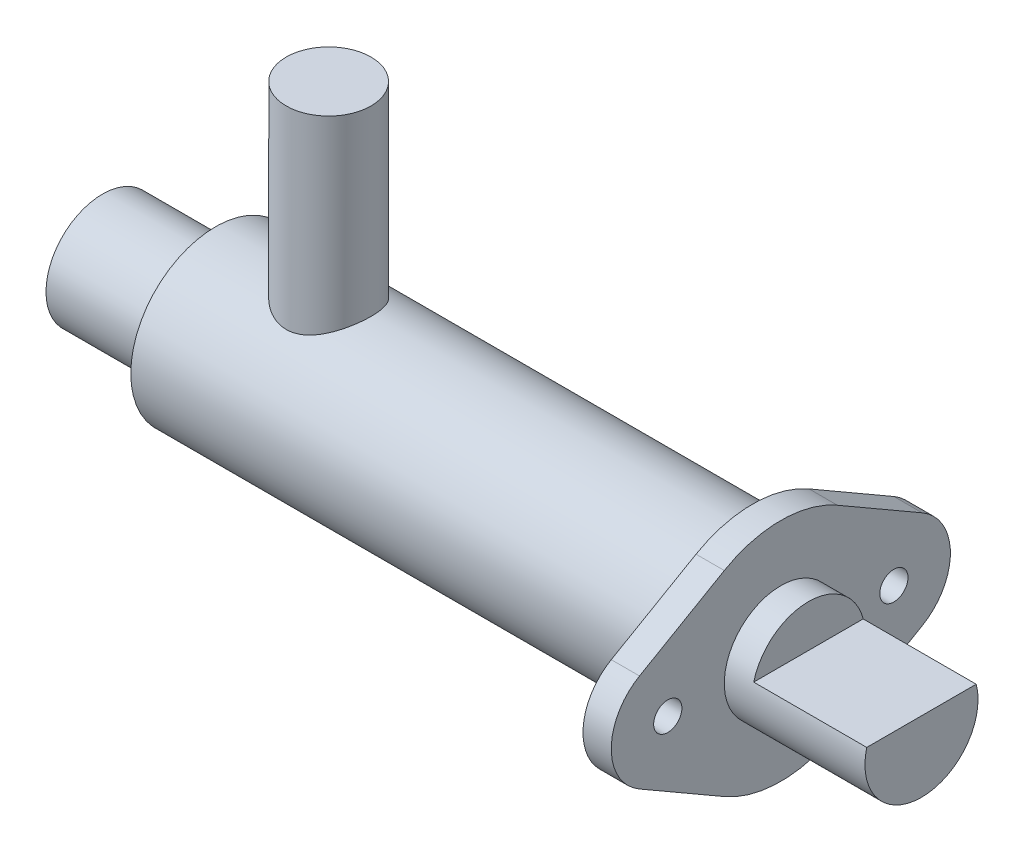
ISO-10303-21;
HEADER;
FILE_DESCRIPTION(('STEP AP214'),'2;1');
FILE_NAME('part.step','',(''),(''),'','','');
FILE_SCHEMA(('AUTOMOTIVE_DESIGN { 1 0 10303 214 1 1 1 1 }'));
ENDSEC;
DATA;
#1=APPLICATION_CONTEXT('core data for automotive mechanical design processes');
#2=APPLICATION_PROTOCOL_DEFINITION('international standard','automotive_design',2000,#1);
#3=PRODUCT_CONTEXT('',#1,'mechanical');
#4=PRODUCT('Part','Part','',(#3));
#5=PRODUCT_RELATED_PRODUCT_CATEGORY('part','',(#4));
#6=PRODUCT_DEFINITION_FORMATION('','',#4);
#7=PRODUCT_DEFINITION_CONTEXT('part definition',#1,'design');
#8=PRODUCT_DEFINITION('design','',#6,#7);
#9=PRODUCT_DEFINITION_SHAPE('','',#8);
#10=(LENGTH_UNIT() NAMED_UNIT(*) SI_UNIT(.MILLI.,.METRE.));
#11=(NAMED_UNIT(*) PLANE_ANGLE_UNIT() SI_UNIT($,.RADIAN.));
#12=(NAMED_UNIT(*) SI_UNIT($,.STERADIAN.) SOLID_ANGLE_UNIT());
#13=UNCERTAINTY_MEASURE_WITH_UNIT(LENGTH_MEASURE(1.E-05),#10,'distance_accuracy_value','');
#14=(GEOMETRIC_REPRESENTATION_CONTEXT(3) GLOBAL_UNCERTAINTY_ASSIGNED_CONTEXT((#13)) GLOBAL_UNIT_ASSIGNED_CONTEXT((#10,
#11,#12)) REPRESENTATION_CONTEXT('',''));
#15=CARTESIAN_POINT('',(0.,0.,0.));
#16=DIRECTION('',(0.,0.,1.));
#17=DIRECTION('',(1.,0.,0.));
#18=AXIS2_PLACEMENT_3D('',#15,#16,#17);
#19=CARTESIAN_POINT('',(-47.625,0.,0.));
#20=DIRECTION('',(-1.,0.,0.));
#21=DIRECTION('',(0.,0.,1.));
#22=AXIS2_PLACEMENT_3D('',#19,#20,#21);
#23=CYLINDRICAL_SURFACE('',#22,9.525);
#24=CARTESIAN_POINT('',(-34.925,0.,0.));
#25=DIRECTION('',(-1.,0.,0.));
#26=DIRECTION('',(0.,0.,1.));
#27=AXIS2_PLACEMENT_3D('',#24,#25,#26);
#28=CIRCLE('',#27,9.525);
#29=CARTESIAN_POINT('',(-34.925,0.,9.525));
#30=VERTEX_POINT('',#29);
#31=EDGE_CURVE('E49',#30,#30,#28,.T.);
#32=ORIENTED_EDGE('',*,*,#31,.F.);
#33=EDGE_LOOP('',(#32));
#34=FACE_BOUND('',#33,.T.);
#35=CARTESIAN_POINT('',(25.4,0.,0.));
#36=DIRECTION('',(-1.,0.,0.));
#37=DIRECTION('',(0.,0.,1.));
#38=AXIS2_PLACEMENT_3D('',#35,#36,#37);
#39=CIRCLE('',#38,9.525);
#40=CARTESIAN_POINT('',(25.4,0.,9.525));
#41=VERTEX_POINT('',#40);
#42=EDGE_CURVE('E11',#41,#41,#39,.F.);
#43=ORIENTED_EDGE('',*,*,#42,.F.);
#44=EDGE_LOOP('',(#43));
#45=FACE_BOUND('',#44,.T.);
#46=CARTESIAN_POINT('',(-22.225,8.24889197104678,-4.7625));
#47=CARTESIAN_POINT('',(-22.1008590969017,8.24889272394164,-4.76249940729929));
#48=CARTESIAN_POINT('',(-21.9767071497996,8.25170408952825,-4.75763943059537));
#49=CARTESIAN_POINT('',(-21.7293616546142,8.26284430339843,-4.73826449608749));
#50=CARTESIAN_POINT('',(-21.6061685797408,8.27117572034719,-4.72374504339219));
#51=CARTESIAN_POINT('',(-21.3615458554706,8.29306424044599,-4.68521103701737));
#52=CARTESIAN_POINT('',(-21.2401192826448,8.30662953786715,-4.66118159277235));
#53=CARTESIAN_POINT('',(-21.0000683650749,8.33849424083486,-4.60393332228032));
#54=CARTESIAN_POINT('',(-20.8814452632816,8.35679570478326,-4.57071050003109));
#55=CARTESIAN_POINT('',(-20.5323015748237,8.41767757563678,-4.45820926505094));
#56=CARTESIAN_POINT('',(-20.3069199645013,8.46639036631087,-4.36584227707579));
#57=CARTESIAN_POINT('',(-19.8750282380635,8.57453511094491,-4.14940045989174));
#58=CARTESIAN_POINT('',(-19.6685191436925,8.63396764474657,-4.02532391532954));
#59=CARTESIAN_POINT('',(-19.2612861365955,8.76284791263908,-3.73698658313422));
#60=CARTESIAN_POINT('',(-19.0624441753375,8.83271738343829,-3.57025552600526));
#61=CARTESIAN_POINT('',(-18.6940167283998,8.97122433178734,-3.20633353614955));
#62=CARTESIAN_POINT('',(-18.5244458361945,9.03986117960625,-3.00912750204738));
#63=CARTESIAN_POINT('',(-18.2900068266763,9.13908932048077,-2.68636629044315));
#64=CARTESIAN_POINT('',(-18.2131527226233,9.17251360649317,-2.57020878007104));
#65=CARTESIAN_POINT('',(-18.069596196185,9.23620349246427,-2.33097830003148));
#66=CARTESIAN_POINT('',(-18.0028897332615,9.26647034811662,-2.20790810968896));
#67=CARTESIAN_POINT('',(-17.8802891396933,9.32297018211123,-1.95564815668434));
#68=CARTESIAN_POINT('',(-17.8243922237504,9.34920419923749,-1.82645998115371));
#69=CARTESIAN_POINT('',(-17.7240269574238,9.39686248352726,-1.56285911383248));
#70=CARTESIAN_POINT('',(-17.6795573931323,9.41828726153724,-1.42844697872178));
#71=CARTESIAN_POINT('',(-17.6053602243203,9.45432792849539,-1.16519740858918));
#72=CARTESIAN_POINT('',(-17.5748091705922,9.46931966688269,-1.03664325296874));
#73=CARTESIAN_POINT('',(-17.5244444767481,9.49415396935545,-0.776963002287312));
#74=CARTESIAN_POINT('',(-17.5046297912202,9.50399703476961,-0.645837158923183));
#75=CARTESIAN_POINT('',(-17.4760065343755,9.51824582475992,-0.382159245593984));
#76=CARTESIAN_POINT('',(-17.4671926503398,9.52265417396123,-0.249607895282792));
#77=CARTESIAN_POINT('',(-17.4606765974385,9.52591136422363,0.0158324946519545));
#78=CARTESIAN_POINT('',(-17.4629737487424,9.52476054542327,0.148721513117989));
#79=CARTESIAN_POINT('',(-17.4779596490716,9.51727773119995,0.402105764472281));
#80=CARTESIAN_POINT('',(-17.489724135882,9.5114066080277,0.522670621045648));
#81=CARTESIAN_POINT('',(-17.52234802378,9.49520689673846,0.762297504084285));
#82=CARTESIAN_POINT('',(-17.5432102971939,9.48487690088979,0.881359043701557));
#83=CARTESIAN_POINT('',(-17.5937985131175,9.4600084221586,1.1170953858544));
#84=CARTESIAN_POINT('',(-17.6235214848597,9.44547134984976,1.23377097435057));
#85=CARTESIAN_POINT('',(-17.6915263412339,9.41253030003386,1.46405663273085));
#86=CARTESIAN_POINT('',(-17.7298115145343,9.39412483687505,1.57766550587512));
#87=CARTESIAN_POINT('',(-17.8581442489874,9.33315909327112,1.91586173980296));
#88=CARTESIAN_POINT('',(-17.961008933467,9.28518547508369,2.13476891421778));
#89=CARTESIAN_POINT('',(-18.1971915319788,9.1791264414455,2.55262754610699));
#90=CARTESIAN_POINT('',(-18.330520348699,9.12103740760329,2.75157182236461));
#91=CARTESIAN_POINT('',(-18.6383264592419,8.99371794927081,3.14406030579801));
#92=CARTESIAN_POINT('',(-18.815502061308,8.92395340854905,3.33531640619751));
#93=CARTESIAN_POINT('',(-19.1988972053729,8.78462733363278,3.68669670801986));
#94=CARTESIAN_POINT('',(-19.4051388849274,8.71506599580986,3.84679695689711));
#95=CARTESIAN_POINT('',(-19.7401135248814,8.61432292972857,4.06522723980458));
#96=CARTESIAN_POINT('',(-19.859994477451,8.58040455630013,4.13613898270465));
#97=CARTESIAN_POINT('',(-20.1061806073308,8.51583950077812,4.2674875647323));
#98=CARTESIAN_POINT('',(-20.2324828617701,8.48519134947439,4.32792911546943));
#99=CARTESIAN_POINT('',(-20.4907225092646,8.42829064611799,4.43772127646409));
#100=CARTESIAN_POINT('',(-20.6226579040663,8.40203655134898,4.48707578138171));
#101=CARTESIAN_POINT('',(-20.8912053825654,8.35498507502528,4.57409004971375));
#102=CARTESIAN_POINT('',(-21.0278145200478,8.33418432493701,4.61175703516624));
#103=CARTESIAN_POINT('',(-21.2937251064497,8.30033105740274,4.67239107161606));
#104=CARTESIAN_POINT('',(-21.4227546942039,8.28679731609861,4.69628224178035));
#105=CARTESIAN_POINT('',(-21.6827672095106,8.26567972970449,4.73335209140224));
#106=CARTESIAN_POINT('',(-21.8137490850902,8.25809279049908,4.74653634178892));
#107=CARTESIAN_POINT('',(-22.0765199908754,8.24918359612277,4.76200330923097));
#108=CARTESIAN_POINT('',(-22.208308702214,8.24785900822165,4.76429008560556));
#109=CARTESIAN_POINT('',(-22.4715269161829,8.25152581127932,4.75793657566527));
#110=CARTESIAN_POINT('',(-22.6029564424594,8.25651677591305,4.74929702692111));
#111=CARTESIAN_POINT('',(-22.8499235335336,8.27171481492305,4.72277057816311));
#112=CARTESIAN_POINT('',(-22.9656220514088,8.28128924981291,4.7060027358946));
#113=CARTESIAN_POINT('',(-23.19504203488,8.30494741203159,4.66412284465984));
#114=CARTESIAN_POINT('',(-23.3087628674355,8.3190325561764,4.63900817385685));
#115=CARTESIAN_POINT('',(-23.64585381483,8.36742301080679,4.55152408813005));
#116=CARTESIAN_POINT('',(-23.8653138630672,8.40787423037301,4.47699683650417));
#117=CARTESIAN_POINT('',(-24.2986813068859,8.50278882622772,4.29409140569222));
#118=CARTESIAN_POINT('',(-24.5118607665569,8.55781440671015,4.18430528181162));
#119=CARTESIAN_POINT('',(-24.9180392026927,8.67518529385013,3.93519108835804));
#120=CARTESIAN_POINT('',(-25.1110277360791,8.73753435328997,3.79584784304953));
#121=CARTESIAN_POINT('',(-25.4967340619561,8.87196405469708,3.4710976585416));
#122=CARTESIAN_POINT('',(-25.6863511708933,8.94428069402612,3.28209830684247));
#123=CARTESIAN_POINT('',(-26.0322210496743,9.08372577215842,2.87366994707528));
#124=CARTESIAN_POINT('',(-26.1884625493693,9.15085245356966,2.65423070130585));
#125=CARTESIAN_POINT('',(-26.3960065237566,9.24324496229829,2.30289806207734));
#126=CARTESIAN_POINT('',(-26.4613981500596,9.27299632526352,2.18030840919905));
#127=CARTESIAN_POINT('',(-26.581503084002,9.32847745043035,1.92915304044621));
#128=CARTESIAN_POINT('',(-26.6362211212174,9.35420899284426,1.80059000285164));
#129=CARTESIAN_POINT('',(-26.7343425578048,9.40087915370989,1.53844708260747));
#130=CARTESIAN_POINT('',(-26.7777513541146,9.42182005774161,1.40486962786039));
#131=CARTESIAN_POINT('',(-26.8527298949067,9.45827821966215,1.13371049467199));
#132=CARTESIAN_POINT('',(-26.8843010432804,9.47379612067972,0.996129293143722));
#133=CARTESIAN_POINT('',(-26.9328217695269,9.49775785076806,0.730949873202789));
#134=CARTESIAN_POINT('',(-26.9508474215171,9.50672024509145,0.603594424498007));
#135=CARTESIAN_POINT('',(-26.9765400141555,9.51951815365963,0.347590307680262));
#136=CARTESIAN_POINT('',(-26.9842077551466,9.52335406402124,0.218941740258937));
#137=CARTESIAN_POINT('',(-26.9890841762651,9.52579195912168,-0.0385649394422882));
#138=CARTESIAN_POINT('',(-26.9862959003281,9.52439546710759,-0.167422979823386));
#139=CARTESIAN_POINT('',(-26.9703049482656,9.51641162435963,-0.42432469061339));
#140=CARTESIAN_POINT('',(-26.9571025588401,9.50982441652587,-0.552368383343416));
#141=CARTESIAN_POINT('',(-26.921665410355,9.4922422956568,-0.798199011861468));
#142=CARTESIAN_POINT('',(-26.9000863753989,9.48156800281864,-0.916103849257604));
#143=CARTESIAN_POINT('',(-26.8482319693504,9.45610870385304,-1.14954398448084));
#144=CARTESIAN_POINT('',(-26.8179538290378,9.44132238877767,-1.26507851519123));
#145=CARTESIAN_POINT('',(-26.7145056473315,9.39128133846021,-1.60695881055025));
#146=CARTESIAN_POINT('',(-26.6286914163555,9.35032881269076,-1.8287887060402));
#147=CARTESIAN_POINT('',(-26.4220557838121,9.25477034679553,-2.26424000888416));
#148=CARTESIAN_POINT('',(-26.2998940929096,9.1996553597058,-2.47710454166772));
#149=CARTESIAN_POINT('',(-26.0256747343117,9.08152237528229,-2.88023067814637));
#150=CARTESIAN_POINT('',(-25.873603335527,9.01850075296339,-3.07048183578565));
#151=CARTESIAN_POINT('',(-25.5263886495207,8.88342722741462,-3.44287591291447));
#152=CARTESIAN_POINT('',(-25.3284649955475,8.81110081200555,-3.62232759996091));
#153=CARTESIAN_POINT('',(-24.9040995620519,8.67074486013806,-3.94652779549558));
#154=CARTESIAN_POINT('',(-24.6776328202441,8.60271916402209,-4.09124560184487));
#155=CARTESIAN_POINT('',(-24.3164807674514,8.50907579729457,-4.28094082941504));
#156=CARTESIAN_POINT('',(-24.190363422381,8.47885685291069,-4.34031088280345));
#157=CARTESIAN_POINT('',(-23.932589170762,8.42284293524443,-4.44803619028847));
#158=CARTESIAN_POINT('',(-23.8009351588988,8.39704568515324,-4.49639711741463));
#159=CARTESIAN_POINT('',(-23.5333464997363,8.35096779630417,-4.58140792637852));
#160=CARTESIAN_POINT('',(-23.397423874586,8.33067298601897,-4.61808793582061));
#161=CARTESIAN_POINT('',(-23.1221672323918,8.29641582497272,-4.67935352294883));
#162=CARTESIAN_POINT('',(-22.982835672277,8.28244904731642,-4.70394755663098));
#163=CARTESIAN_POINT('',(-22.7403045126998,8.26434282908569,-4.73566148400959));
#164=CARTESIAN_POINT('',(-22.637599934044,8.25856285278519,-4.74571628165859));
#165=CARTESIAN_POINT('',(-22.431599478867,8.25083698225999,-4.7591360100298));
#166=CARTESIAN_POINT('',(-22.3283035632528,8.24889134452708,-4.76250049321452));
#167=CARTESIAN_POINT('',(-22.225,8.24889197104678,-4.7625));
#168=B_SPLINE_CURVE_WITH_KNOTS('',3,(#46,#47,#48,#49,#50,#51,#52,#53,#54,#55,#56,#57,#58,#59,
#60,#61,#62,#63,#64,#65,#66,#67,#68,#69,#70,#71,#72,#73,#74,#75,#76,#77,#78,#79,#80,#81,#82,#83,
#84,#85,#86,#87,#88,#89,#90,#91,#92,#93,#94,#95,#96,#97,#98,#99,#100,#101,#102,#103,#104,#105,
#106,#107,#108,#109,#110,#111,#112,#113,#114,#115,#116,#117,#118,#119,#120,#121,#122,#123,#124,
#125,#126,#127,#128,#129,#130,#131,#132,#133,#134,#135,#136,#137,#138,#139,#140,#141,#142,#143,
#144,#145,#146,#147,#148,#149,#150,#151,#152,#153,#154,#155,#156,#157,#158,#159,#160,#161,#162,
#163,#164,#165,#166,#167),.UNSPECIFIED.,.T.,.F.,(4,2,2,2,2,2,2,2,2,2,2,2,2,2,2,2,2,2,2,2,2,2,2,
2,2,2,2,2,2,2,2,2,2,2,2,2,2,2,2,2,2,2,2,2,2,2,2,2,2,2,2,2,2,2,2,2,2,2,2,2,4),(0.,
0.372315471290052,0.74480431525927,1.11787871748513,1.49111553598561,2.23280682202776,
2.97453823893684,3.77744614727716,4.58075320689749,5.00998800301853,5.43905143864814,
5.8680041696826,6.29691131496348,6.69531812541003,7.09368613557448,7.4918616836556,
7.89001286961349,8.25342137640537,8.61694470062129,8.98034628149851,9.3438876822603,
10.0802760151874,10.8169283051732,11.6232144167404,12.4301179713144,12.8597106878863,
13.289109581744,13.7183573995584,14.1473394427285,14.5425345752374,14.9375239513556,
15.3323661820562,15.7271817607473,16.0786628916725,16.4302545314545,17.1329551681528,
17.8682015372252,18.603826327115,19.432180208912,20.2608133654722,20.6865967300835,
21.1121909950173,21.5375817864788,21.9629221125511,22.3492223853007,22.7354928073989,
23.1216507879208,23.5077981379075,23.8683853074205,24.2290873914766,24.9498683654814,
25.7014774099866,26.4534323155185,27.2802219250812,28.1077396849722,28.5351353836894,
28.9623103432981,29.388374431565,29.8141399966485,30.1239407256422,30.4337621775449),.UNSPECIFIED.);
#169=CARTESIAN_POINT('',(-22.225,8.24889197104678,-4.7625));
#170=VERTEX_POINT('',#169);
#171=EDGE_CURVE('E40',#170,#170,#168,.T.);
#172=ORIENTED_EDGE('',*,*,#171,.T.);
#173=EDGE_LOOP('',(#172));
#174=FACE_BOUND('',#173,.T.);
#175=ADVANCED_FACE('F36',(#34,#45,#174),#23,.T.);
#176=CARTESIAN_POINT('',(-34.925,-6.35,0.));
#177=DIRECTION('',(-1.,0.,0.));
#178=DIRECTION('',(0.,0.,1.));
#179=AXIS2_PLACEMENT_3D('',#176,#177,#178);
#180=PLANE('',#179);
#181=ORIENTED_EDGE('',*,*,#31,.T.);
#182=EDGE_LOOP('',(#181));
#183=FACE_BOUND('',#182,.T.);
#184=CARTESIAN_POINT('',(-34.925,0.,0.));
#185=DIRECTION('',(-1.,0.,0.));
#186=DIRECTION('',(0.,0.,1.));
#187=AXIS2_PLACEMENT_3D('',#184,#185,#186);
#188=CIRCLE('',#187,6.35);
#189=CARTESIAN_POINT('',(-34.925,0.,6.35));
#190=VERTEX_POINT('',#189);
#191=EDGE_CURVE('E196',#190,#190,#188,.T.);
#192=ORIENTED_EDGE('',*,*,#191,.F.);
#193=EDGE_LOOP('',(#192));
#194=FACE_BOUND('',#193,.T.);
#195=ADVANCED_FACE('F202',(#183,#194),#180,.T.);
#196=CARTESIAN_POINT('',(-47.625,0.,0.));
#197=DIRECTION('',(-1.,0.,0.));
#198=DIRECTION('',(0.,0.,1.));
#199=AXIS2_PLACEMENT_3D('',#196,#197,#198);
#200=CYLINDRICAL_SURFACE('',#199,6.35);
#201=ORIENTED_EDGE('',*,*,#191,.T.);
#202=EDGE_LOOP('',(#201));
#203=FACE_BOUND('',#202,.T.);
#204=CARTESIAN_POINT('',(-47.625,0.,0.));
#205=DIRECTION('',(-1.,0.,0.));
#206=DIRECTION('',(0.,0.,1.));
#207=AXIS2_PLACEMENT_3D('',#204,#205,#206);
#208=CIRCLE('',#207,6.35);
#209=CARTESIAN_POINT('',(-47.625,0.,6.35));
#210=VERTEX_POINT('',#209);
#211=EDGE_CURVE('E193',#210,#210,#208,.T.);
#212=ORIENTED_EDGE('',*,*,#211,.F.);
#213=EDGE_LOOP('',(#212));
#214=FACE_BOUND('',#213,.T.);
#215=ADVANCED_FACE('F292',(#203,#214),#200,.T.);
#216=CARTESIAN_POINT('',(-47.625,0.,0.));
#217=DIRECTION('',(-1.,0.,0.));
#218=DIRECTION('',(0.,0.,1.));
#219=AXIS2_PLACEMENT_3D('',#216,#217,#218);
#220=PLANE('',#219);
#221=ORIENTED_EDGE('',*,*,#211,.T.);
#222=EDGE_LOOP('',(#221));
#223=FACE_BOUND('',#222,.T.);
#224=ADVANCED_FACE('F289',(#223),#220,.T.);
#225=CARTESIAN_POINT('',(25.4,0.,12.7));
#226=DIRECTION('',(1.,0.,0.));
#227=DIRECTION('',(0.,0.,-1.));
#228=AXIS2_PLACEMENT_3D('',#225,#226,#227);
#229=CYLINDRICAL_SURFACE('',#228,6.34999999999998);
#230=CARTESIAN_POINT('',(28.575,0.,12.7));
#231=DIRECTION('',(-1.,0.,0.));
#232=DIRECTION('',(0.,0.,1.));
#233=AXIS2_PLACEMENT_3D('',#230,#231,#232);
#234=CIRCLE('',#233,6.34999999999998);
#235=CARTESIAN_POINT('',(28.575,-5.4992613140312,15.875));
#236=VERTEX_POINT('',#235);
#237=CARTESIAN_POINT('',(28.575,5.49926131403114,15.875));
#238=VERTEX_POINT('',#237);
#239=EDGE_CURVE('E157',#236,#238,#234,.T.);
#240=ORIENTED_EDGE('',*,*,#239,.T.);
#241=DIRECTION('',(1.,0.,0.));
#242=VECTOR('',#241,1.);
#243=CARTESIAN_POINT('',(25.4,5.49926131403114,15.875));
#244=LINE('',#243,#242);
#245=CARTESIAN_POINT('',(25.4,5.49926131403114,15.875));
#246=VERTEX_POINT('',#245);
#247=EDGE_CURVE('E191',#246,#238,#244,.T.);
#248=ORIENTED_EDGE('',*,*,#247,.F.);
#249=CARTESIAN_POINT('',(25.4,0.,12.7));
#250=DIRECTION('',(-1.,0.,0.));
#251=DIRECTION('',(0.,0.,1.));
#252=AXIS2_PLACEMENT_3D('',#249,#250,#251);
#253=CIRCLE('',#252,6.34999999999998);
#254=CARTESIAN_POINT('',(25.4,-5.4992613140312,15.875));
#255=VERTEX_POINT('',#254);
#256=EDGE_CURVE('E181',#255,#246,#253,.T.);
#257=ORIENTED_EDGE('',*,*,#256,.F.);
#258=DIRECTION('',(1.,0.,0.));
#259=VECTOR('',#258,1.);
#260=CARTESIAN_POINT('',(25.4,-5.4992613140312,15.875));
#261=LINE('',#260,#259);
#262=EDGE_CURVE('E65',#255,#236,#261,.T.);
#263=ORIENTED_EDGE('',*,*,#262,.T.);
#264=EDGE_LOOP('',(#240,#248,#257,#263));
#265=FACE_BOUND('',#264,.T.);
#266=ADVANCED_FACE('F268',(#265),#229,.T.);
#267=CARTESIAN_POINT('',(25.4,5.49926131403114,15.875));
#268=DIRECTION('',(0.,-0.866025403784437,-0.500000000000003));
#269=DIRECTION('',(0.,0.500000000000003,-0.866025403784437));
#270=AXIS2_PLACEMENT_3D('',#267,#268,#269);
#271=PLANE('',#270);
#272=DIRECTION('',(0.,0.500000000000003,-0.866025403784437));
#273=VECTOR('',#272,1.);
#274=CARTESIAN_POINT('',(28.575,5.49926131403114,15.875));
#275=LINE('',#274,#273);
#276=CARTESIAN_POINT('',(28.575,10.9985226280624,6.35000000000004));
#277=VERTEX_POINT('',#276);
#278=EDGE_CURVE('E159',#238,#277,#275,.T.);
#279=ORIENTED_EDGE('',*,*,#278,.T.);
#280=DIRECTION('',(1.,0.,0.));
#281=VECTOR('',#280,1.);
#282=CARTESIAN_POINT('',(25.4,10.9985226280624,6.35000000000004));
#283=LINE('',#282,#281);
#284=CARTESIAN_POINT('',(25.4,10.9985226280624,6.35000000000004));
#285=VERTEX_POINT('',#284);
#286=EDGE_CURVE('E189',#285,#277,#283,.T.);
#287=ORIENTED_EDGE('',*,*,#286,.F.);
#288=DIRECTION('',(0.,0.500000000000003,-0.866025403784437));
#289=VECTOR('',#288,1.);
#290=CARTESIAN_POINT('',(25.4,5.49926131403114,15.875));
#291=LINE('',#290,#289);
#292=EDGE_CURVE('E105',#246,#285,#291,.T.);
#293=ORIENTED_EDGE('',*,*,#292,.F.);
#294=ORIENTED_EDGE('',*,*,#247,.T.);
#295=EDGE_LOOP('',(#279,#287,#293,#294));
#296=FACE_BOUND('',#295,.T.);
#297=ADVANCED_FACE('F269',(#296),#271,.F.);
#298=CARTESIAN_POINT('',(25.4,0.,0.));
#299=DIRECTION('',(1.,0.,0.));
#300=DIRECTION('',(0.,0.,-1.));
#301=AXIS2_PLACEMENT_3D('',#298,#299,#300);
#302=CYLINDRICAL_SURFACE('',#301,12.7000000000001);
#303=CARTESIAN_POINT('',(28.575,0.,0.));
#304=DIRECTION('',(1.,0.,0.));
#305=DIRECTION('',(0.,0.,-1.));
#306=AXIS2_PLACEMENT_3D('',#303,#304,#305);
#307=CIRCLE('',#306,12.7000000000001);
#308=CARTESIAN_POINT('',(28.575,10.9985226280623,-6.35000000000016));
#309=VERTEX_POINT('',#308);
#310=EDGE_CURVE('E164',#309,#277,#307,.T.);
#311=ORIENTED_EDGE('',*,*,#310,.F.);
#312=DIRECTION('',(1.,0.,0.));
#313=VECTOR('',#312,1.);
#314=CARTESIAN_POINT('',(25.4,10.9985226280623,-6.35000000000016));
#315=LINE('',#314,#313);
#316=CARTESIAN_POINT('',(25.4,10.9985226280623,-6.35000000000016));
#317=VERTEX_POINT('',#316);
#318=EDGE_CURVE('E187',#317,#309,#315,.T.);
#319=ORIENTED_EDGE('',*,*,#318,.F.);
#320=CARTESIAN_POINT('',(25.4,0.,0.));
#321=DIRECTION('',(1.,0.,0.));
#322=DIRECTION('',(0.,0.,-1.));
#323=AXIS2_PLACEMENT_3D('',#320,#321,#322);
#324=CIRCLE('',#323,12.7000000000001);
#325=EDGE_CURVE('E254',#317,#285,#324,.T.);
#326=ORIENTED_EDGE('',*,*,#325,.T.);
#327=ORIENTED_EDGE('',*,*,#286,.T.);
#328=EDGE_LOOP('',(#311,#319,#326,#327));
#329=FACE_BOUND('',#328,.T.);
#330=ADVANCED_FACE('F272',(#329),#302,.T.);
#331=CARTESIAN_POINT('',(25.4,5.4992613140312,-15.8750000000002));
#332=DIRECTION('',(0.,0.866025403784439,-0.5));
#333=DIRECTION('',(0.,0.5,0.866025403784439));
#334=AXIS2_PLACEMENT_3D('',#331,#332,#333);
#335=PLANE('',#334);
#336=DIRECTION('',(0.,0.5,0.866025403784439));
#337=VECTOR('',#336,1.);
#338=CARTESIAN_POINT('',(28.575,5.4992613140312,-15.8750000000002));
#339=LINE('',#338,#337);
#340=CARTESIAN_POINT('',(28.575,5.4992613140312,-15.8750000000002));
#341=VERTEX_POINT('',#340);
#342=EDGE_CURVE('E168',#341,#309,#339,.T.);
#343=ORIENTED_EDGE('',*,*,#342,.F.);
#344=DIRECTION('',(1.,0.,0.));
#345=VECTOR('',#344,1.);
#346=CARTESIAN_POINT('',(25.4,5.4992613140312,-15.8750000000002));
#347=LINE('',#346,#345);
#348=CARTESIAN_POINT('',(25.4,5.4992613140312,-15.8750000000002));
#349=VERTEX_POINT('',#348);
#350=EDGE_CURVE('E185',#349,#341,#347,.T.);
#351=ORIENTED_EDGE('',*,*,#350,.F.);
#352=DIRECTION('',(0.,0.5,0.866025403784439));
#353=VECTOR('',#352,1.);
#354=CARTESIAN_POINT('',(25.4,5.4992613140312,-15.8750000000002));
#355=LINE('',#354,#353);
#356=EDGE_CURVE('E258',#349,#317,#355,.T.);
#357=ORIENTED_EDGE('',*,*,#356,.T.);
#358=ORIENTED_EDGE('',*,*,#318,.T.);
#359=EDGE_LOOP('',(#343,#351,#357,#358));
#360=FACE_BOUND('',#359,.T.);
#361=ADVANCED_FACE('F274',(#360),#335,.T.);
#362=CARTESIAN_POINT('',(25.4,0.,-12.7000000000002));
#363=DIRECTION('',(1.,0.,0.));
#364=DIRECTION('',(0.,0.,-1.));
#365=AXIS2_PLACEMENT_3D('',#362,#363,#364);
#366=CYLINDRICAL_SURFACE('',#365,6.34999999999999);
#367=CARTESIAN_POINT('',(28.575,0.,-12.7000000000002));
#368=DIRECTION('',(1.,0.,0.));
#369=DIRECTION('',(0.,0.,-1.));
#370=AXIS2_PLACEMENT_3D('',#367,#368,#369);
#371=CIRCLE('',#370,6.34999999999999);
#372=CARTESIAN_POINT('',(28.575,-5.49926131403115,-15.8750000000002));
#373=VERTEX_POINT('',#372);
#374=EDGE_CURVE('E171',#373,#341,#371,.T.);
#375=ORIENTED_EDGE('',*,*,#374,.F.);
#376=DIRECTION('',(1.,0.,0.));
#377=VECTOR('',#376,1.);
#378=CARTESIAN_POINT('',(25.4,-5.49926131403115,-15.8750000000002));
#379=LINE('',#378,#377);
#380=CARTESIAN_POINT('',(25.4,-5.49926131403115,-15.8750000000002));
#381=VERTEX_POINT('',#380);
#382=EDGE_CURVE('E144',#381,#373,#379,.T.);
#383=ORIENTED_EDGE('',*,*,#382,.F.);
#384=CARTESIAN_POINT('',(25.4,0.,-12.7000000000002));
#385=DIRECTION('',(1.,0.,0.));
#386=DIRECTION('',(0.,0.,-1.));
#387=AXIS2_PLACEMENT_3D('',#384,#385,#386);
#388=CIRCLE('',#387,6.34999999999999);
#389=EDGE_CURVE('E133',#381,#349,#388,.T.);
#390=ORIENTED_EDGE('',*,*,#389,.T.);
#391=ORIENTED_EDGE('',*,*,#350,.T.);
#392=EDGE_LOOP('',(#375,#383,#390,#391));
#393=FACE_BOUND('',#392,.T.);
#394=ADVANCED_FACE('F262',(#393),#366,.T.);
#395=CARTESIAN_POINT('',(25.4,-5.49926131403114,-15.8750000000002));
#396=DIRECTION('',(0.,0.866025403784437,0.500000000000002));
#397=DIRECTION('',(0.,-0.500000000000002,0.866025403784437));
#398=AXIS2_PLACEMENT_3D('',#395,#396,#397);
#399=PLANE('',#398);
#400=DIRECTION('',(0.,-0.500000000000002,0.866025403784437));
#401=VECTOR('',#400,1.);
#402=CARTESIAN_POINT('',(28.575,-5.49926131403114,-15.8750000000002));
#403=LINE('',#402,#401);
#404=CARTESIAN_POINT('',(28.575,-10.9985226280624,-6.35000000000021));
#405=VERTEX_POINT('',#404);
#406=EDGE_CURVE('E140',#373,#405,#403,.T.);
#407=ORIENTED_EDGE('',*,*,#406,.T.);
#408=DIRECTION('',(1.,0.,0.));
#409=VECTOR('',#408,1.);
#410=CARTESIAN_POINT('',(25.4,-10.9985226280624,-6.35000000000021));
#411=LINE('',#410,#409);
#412=CARTESIAN_POINT('',(25.4,-10.9985226280624,-6.35000000000021));
#413=VERTEX_POINT('',#412);
#414=EDGE_CURVE('E137',#413,#405,#411,.T.);
#415=ORIENTED_EDGE('',*,*,#414,.F.);
#416=DIRECTION('',(0.,-0.500000000000002,0.866025403784437));
#417=VECTOR('',#416,1.);
#418=CARTESIAN_POINT('',(25.4,-5.49926131403114,-15.8750000000002));
#419=LINE('',#418,#417);
#420=EDGE_CURVE('E125',#381,#413,#419,.T.);
#421=ORIENTED_EDGE('',*,*,#420,.F.);
#422=ORIENTED_EDGE('',*,*,#382,.T.);
#423=EDGE_LOOP('',(#407,#415,#421,#422));
#424=FACE_BOUND('',#423,.T.);
#425=ADVANCED_FACE('F138',(#424),#399,.F.);
#426=CARTESIAN_POINT('',(25.4,0.,0.));
#427=DIRECTION('',(1.,0.,0.));
#428=DIRECTION('',(0.,0.,-1.));
#429=AXIS2_PLACEMENT_3D('',#426,#427,#428);
#430=CYLINDRICAL_SURFACE('',#429,12.7);
#431=CARTESIAN_POINT('',(28.575,0.,0.));
#432=DIRECTION('',(1.,0.,0.));
#433=DIRECTION('',(0.,0.,-1.));
#434=AXIS2_PLACEMENT_3D('',#431,#432,#433);
#435=CIRCLE('',#434,12.7);
#436=CARTESIAN_POINT('',(28.575,-10.9985226280624,6.35000000000004));
#437=VERTEX_POINT('',#436);
#438=EDGE_CURVE('E175',#437,#405,#435,.T.);
#439=ORIENTED_EDGE('',*,*,#438,.F.);
#440=DIRECTION('',(1.,0.,0.));
#441=VECTOR('',#440,1.);
#442=CARTESIAN_POINT('',(25.4,-10.9985226280624,6.35000000000004));
#443=LINE('',#442,#441);
#444=CARTESIAN_POINT('',(25.4,-10.9985226280624,6.35000000000004));
#445=VERTEX_POINT('',#444);
#446=EDGE_CURVE('E145',#445,#437,#443,.T.);
#447=ORIENTED_EDGE('',*,*,#446,.F.);
#448=CARTESIAN_POINT('',(25.4,0.,0.));
#449=DIRECTION('',(1.,0.,0.));
#450=DIRECTION('',(0.,0.,-1.));
#451=AXIS2_PLACEMENT_3D('',#448,#449,#450);
#452=CIRCLE('',#451,12.7);
#453=EDGE_CURVE('E130',#445,#413,#452,.T.);
#454=ORIENTED_EDGE('',*,*,#453,.T.);
#455=ORIENTED_EDGE('',*,*,#414,.T.);
#456=EDGE_LOOP('',(#439,#447,#454,#455));
#457=FACE_BOUND('',#456,.T.);
#458=ADVANCED_FACE('F147',(#457),#430,.T.);
#459=CARTESIAN_POINT('',(25.4,-5.4992613140312,15.875));
#460=DIRECTION('',(0.,-0.866025403784438,0.500000000000001));
#461=DIRECTION('',(0.,-0.500000000000001,-0.866025403784438));
#462=AXIS2_PLACEMENT_3D('',#459,#460,#461);
#463=PLANE('',#462);
#464=DIRECTION('',(0.,-0.500000000000001,-0.866025403784438));
#465=VECTOR('',#464,1.);
#466=CARTESIAN_POINT('',(28.575,-5.4992613140312,15.875));
#467=LINE('',#466,#465);
#468=EDGE_CURVE('E178',#236,#437,#467,.T.);
#469=ORIENTED_EDGE('',*,*,#468,.F.);
#470=ORIENTED_EDGE('',*,*,#262,.F.);
#471=DIRECTION('',(0.,-0.500000000000001,-0.866025403784438));
#472=VECTOR('',#471,1.);
#473=CARTESIAN_POINT('',(25.4,-5.4992613140312,15.875));
#474=LINE('',#473,#472);
#475=EDGE_CURVE('E149',#255,#445,#474,.T.);
#476=ORIENTED_EDGE('',*,*,#475,.T.);
#477=ORIENTED_EDGE('',*,*,#446,.T.);
#478=EDGE_LOOP('',(#469,#470,#476,#477));
#479=FACE_BOUND('',#478,.T.);
#480=ADVANCED_FACE('F265',(#479),#463,.T.);
#481=CARTESIAN_POINT('',(25.4,0.,12.7));
#482=DIRECTION('',(-1.,0.,0.));
#483=DIRECTION('',(0.,0.,1.));
#484=AXIS2_PLACEMENT_3D('',#481,#482,#483);
#485=PLANE('',#484);
#486=ORIENTED_EDGE('',*,*,#42,.T.);
#487=EDGE_LOOP('',(#486));
#488=FACE_BOUND('',#487,.T.);
#489=CARTESIAN_POINT('',(25.4,0.,-12.7000000000002));
#490=DIRECTION('',(1.,0.,0.));
#491=DIRECTION('',(0.,0.,-1.));
#492=AXIS2_PLACEMENT_3D('',#489,#490,#491);
#493=CIRCLE('',#492,1.5875);
#494=CARTESIAN_POINT('',(25.4,0.,-14.2875000000002));
#495=VERTEX_POINT('',#494);
#496=EDGE_CURVE('E237',#495,#495,#493,.T.);
#497=ORIENTED_EDGE('',*,*,#496,.T.);
#498=EDGE_LOOP('',(#497));
#499=FACE_BOUND('',#498,.T.);
#500=CARTESIAN_POINT('',(25.4,0.,12.7));
#501=DIRECTION('',(1.,0.,0.));
#502=DIRECTION('',(0.,0.,-1.));
#503=AXIS2_PLACEMENT_3D('',#500,#501,#502);
#504=CIRCLE('',#503,1.5875);
#505=CARTESIAN_POINT('',(25.4,0.,11.1125));
#506=VERTEX_POINT('',#505);
#507=EDGE_CURVE('E160',#506,#506,#504,.T.);
#508=ORIENTED_EDGE('',*,*,#507,.T.);
#509=EDGE_LOOP('',(#508));
#510=FACE_BOUND('',#509,.T.);
#511=ORIENTED_EDGE('',*,*,#256,.T.);
#512=ORIENTED_EDGE('',*,*,#292,.T.);
#513=ORIENTED_EDGE('',*,*,#325,.F.);
#514=ORIENTED_EDGE('',*,*,#356,.F.);
#515=ORIENTED_EDGE('',*,*,#389,.F.);
#516=ORIENTED_EDGE('',*,*,#420,.T.);
#517=ORIENTED_EDGE('',*,*,#453,.F.);
#518=ORIENTED_EDGE('',*,*,#475,.F.);
#519=EDGE_LOOP('',(#511,#512,#513,#514,#515,#516,#517,#518));
#520=FACE_BOUND('',#519,.T.);
#521=ADVANCED_FACE('F127',(#488,#499,#510,#520),#485,.T.);
#522=CARTESIAN_POINT('',(25.4,0.,12.7));
#523=DIRECTION('',(1.,0.,0.));
#524=DIRECTION('',(0.,0.,-1.));
#525=AXIS2_PLACEMENT_3D('',#522,#523,#524);
#526=CYLINDRICAL_SURFACE('',#525,1.5875);
#527=ORIENTED_EDGE('',*,*,#507,.F.);
#528=EDGE_LOOP('',(#527));
#529=FACE_BOUND('',#528,.T.);
#530=CARTESIAN_POINT('',(28.575,0.,12.7));
#531=DIRECTION('',(1.,0.,0.));
#532=DIRECTION('',(0.,0.,-1.));
#533=AXIS2_PLACEMENT_3D('',#530,#531,#532);
#534=CIRCLE('',#533,1.5875);
#535=CARTESIAN_POINT('',(28.575,0.,11.1125));
#536=VERTEX_POINT('',#535);
#537=EDGE_CURVE('E241',#536,#536,#534,.T.);
#538=ORIENTED_EDGE('',*,*,#537,.T.);
#539=EDGE_LOOP('',(#538));
#540=FACE_BOUND('',#539,.T.);
#541=ADVANCED_FACE('F411',(#529,#540),#526,.F.);
#542=CARTESIAN_POINT('',(25.4,0.,-12.7000000000002));
#543=DIRECTION('',(1.,0.,0.));
#544=DIRECTION('',(0.,0.,-1.));
#545=AXIS2_PLACEMENT_3D('',#542,#543,#544);
#546=CYLINDRICAL_SURFACE('',#545,1.5875);
#547=ORIENTED_EDGE('',*,*,#496,.F.);
#548=EDGE_LOOP('',(#547));
#549=FACE_BOUND('',#548,.T.);
#550=CARTESIAN_POINT('',(28.575,0.,-12.7000000000002));
#551=DIRECTION('',(1.,0.,0.));
#552=DIRECTION('',(0.,0.,-1.));
#553=AXIS2_PLACEMENT_3D('',#550,#551,#552);
#554=CIRCLE('',#553,1.5875);
#555=CARTESIAN_POINT('',(28.575,0.,-14.2875000000002));
#556=VERTEX_POINT('',#555);
#557=EDGE_CURVE('E236',#556,#556,#554,.T.);
#558=ORIENTED_EDGE('',*,*,#557,.T.);
#559=EDGE_LOOP('',(#558));
#560=FACE_BOUND('',#559,.T.);
#561=ADVANCED_FACE('F331',(#549,#560),#546,.F.);
#562=CARTESIAN_POINT('',(28.575,0.,0.));
#563=DIRECTION('',(-1.,0.,0.));
#564=DIRECTION('',(0.,0.,1.));
#565=AXIS2_PLACEMENT_3D('',#562,#563,#564);
#566=PLANE('',#565);
#567=CARTESIAN_POINT('',(28.575,0.,0.));
#568=DIRECTION('',(1.,0.,0.));
#569=DIRECTION('',(0.,0.,-1.));
#570=AXIS2_PLACEMENT_3D('',#567,#568,#569);
#571=CIRCLE('',#570,6.35);
#572=CARTESIAN_POINT('',(28.575,0.,-6.35));
#573=VERTEX_POINT('',#572);
#574=EDGE_CURVE('E233',#573,#573,#571,.T.);
#575=ORIENTED_EDGE('',*,*,#574,.F.);
#576=EDGE_LOOP('',(#575));
#577=FACE_BOUND('',#576,.T.);
#578=ORIENTED_EDGE('',*,*,#557,.F.);
#579=EDGE_LOOP('',(#578));
#580=FACE_BOUND('',#579,.T.);
#581=ORIENTED_EDGE('',*,*,#537,.F.);
#582=EDGE_LOOP('',(#581));
#583=FACE_BOUND('',#582,.T.);
#584=ORIENTED_EDGE('',*,*,#239,.F.);
#585=ORIENTED_EDGE('',*,*,#468,.T.);
#586=ORIENTED_EDGE('',*,*,#438,.T.);
#587=ORIENTED_EDGE('',*,*,#406,.F.);
#588=ORIENTED_EDGE('',*,*,#374,.T.);
#589=ORIENTED_EDGE('',*,*,#342,.T.);
#590=ORIENTED_EDGE('',*,*,#310,.T.);
#591=ORIENTED_EDGE('',*,*,#278,.F.);
#592=EDGE_LOOP('',(#584,#585,#586,#587,#588,#589,#590,#591));
#593=FACE_BOUND('',#592,.T.);
#594=ADVANCED_FACE('F38',(#577,#580,#583,#593),#566,.F.);
#595=CARTESIAN_POINT('',(44.3761161124671,0.,0.));
#596=DIRECTION('',(-1.,0.,0.));
#597=DIRECTION('',(0.,-1.,0.));
#598=AXIS2_PLACEMENT_3D('',#595,#596,#597);
#599=CYLINDRICAL_SURFACE('',#598,6.35);
#600=CARTESIAN_POINT('',(44.3761161124671,0.,0.));
#601=DIRECTION('',(1.,0.,0.));
#602=DIRECTION('',(0.,1.,0.));
#603=AXIS2_PLACEMENT_3D('',#600,#601,#602);
#604=CIRCLE('',#603,6.35);
#605=CARTESIAN_POINT('',(44.3761161124671,1.5875,6.14836106210428));
#606=VERTEX_POINT('',#605);
#607=CARTESIAN_POINT('',(44.3761161124671,1.5875,-6.14836106210428));
#608=VERTEX_POINT('',#607);
#609=EDGE_CURVE('E229',#606,#608,#604,.T.);
#610=ORIENTED_EDGE('',*,*,#609,.F.);
#611=DIRECTION('',(1.,0.,0.));
#612=VECTOR('',#611,1.);
#613=CARTESIAN_POINT('',(31.6761161124671,1.5875,6.14836106210428));
#614=LINE('',#613,#612);
#615=CARTESIAN_POINT('',(31.6761161124671,1.5875,6.14836106210428));
#616=VERTEX_POINT('',#615);
#617=EDGE_CURVE('E56',#616,#606,#614,.T.);
#618=ORIENTED_EDGE('',*,*,#617,.F.);
#619=CARTESIAN_POINT('',(31.6761161124671,0.,0.));
#620=DIRECTION('',(1.,0.,0.));
#621=DIRECTION('',(0.,1.,0.));
#622=AXIS2_PLACEMENT_3D('',#619,#620,#621);
#623=CIRCLE('',#622,6.35);
#624=CARTESIAN_POINT('',(31.6761161124671,1.5875,-6.14836106210428));
#625=VERTEX_POINT('',#624);
#626=EDGE_CURVE('E214',#625,#616,#623,.T.);
#627=ORIENTED_EDGE('',*,*,#626,.F.);
#628=DIRECTION('',(1.,0.,0.));
#629=VECTOR('',#628,1.);
#630=CARTESIAN_POINT('',(31.6761161124671,1.5875,-6.14836106210428));
#631=LINE('',#630,#629);
#632=EDGE_CURVE('E226',#625,#608,#631,.T.);
#633=ORIENTED_EDGE('',*,*,#632,.T.);
#634=EDGE_LOOP('',(#610,#618,#627,#633));
#635=FACE_BOUND('',#634,.T.);
#636=ORIENTED_EDGE('',*,*,#574,.T.);
#637=EDGE_LOOP('',(#636));
#638=FACE_BOUND('',#637,.T.);
#639=ADVANCED_FACE('F330',(#635,#638),#599,.T.);
#640=CARTESIAN_POINT('',(44.3761161124671,0.,0.));
#641=DIRECTION('',(1.,0.,0.));
#642=DIRECTION('',(0.,1.,0.));
#643=AXIS2_PLACEMENT_3D('',#640,#641,#642);
#644=PLANE('',#643);
#645=DIRECTION('',(0.,0.,-1.));
#646=VECTOR('',#645,1.);
#647=CARTESIAN_POINT('',(44.3761161124671,1.5875,6.14836106210428));
#648=LINE('',#647,#646);
#649=EDGE_CURVE('E212',#606,#608,#648,.T.);
#650=ORIENTED_EDGE('',*,*,#649,.F.);
#651=ORIENTED_EDGE('',*,*,#609,.T.);
#652=EDGE_LOOP('',(#650,#651));
#653=FACE_BOUND('',#652,.T.);
#654=ADVANCED_FACE('F346',(#653),#644,.T.);
#655=CARTESIAN_POINT('',(31.6761161124671,1.5875,6.14836106210428));
#656=DIRECTION('',(0.,-1.,0.));
#657=DIRECTION('',(1.,0.,0.));
#658=AXIS2_PLACEMENT_3D('',#655,#656,#657);
#659=PLANE('',#658);
#660=ORIENTED_EDGE('',*,*,#649,.T.);
#661=ORIENTED_EDGE('',*,*,#632,.F.);
#662=DIRECTION('',(0.,0.,-1.));
#663=VECTOR('',#662,1.);
#664=CARTESIAN_POINT('',(31.6761161124671,1.5875,6.14836106210428));
#665=LINE('',#664,#663);
#666=EDGE_CURVE('E223',#616,#625,#665,.T.);
#667=ORIENTED_EDGE('',*,*,#666,.F.);
#668=ORIENTED_EDGE('',*,*,#617,.T.);
#669=EDGE_LOOP('',(#660,#661,#667,#668));
#670=FACE_BOUND('',#669,.T.);
#671=ADVANCED_FACE('F354',(#670),#659,.F.);
#672=CARTESIAN_POINT('',(31.6761161124671,0.,0.));
#673=DIRECTION('',(1.,0.,0.));
#674=DIRECTION('',(0.,1.,0.));
#675=AXIS2_PLACEMENT_3D('',#672,#673,#674);
#676=PLANE('',#675);
#677=ORIENTED_EDGE('',*,*,#626,.T.);
#678=ORIENTED_EDGE('',*,*,#666,.T.);
#679=EDGE_LOOP('',(#677,#678));
#680=FACE_BOUND('',#679,.T.);
#681=ADVANCED_FACE('F362',(#680),#676,.T.);
#682=CARTESIAN_POINT('',(-22.225,30.,0.));
#683=DIRECTION('',(0.,-1.,0.));
#684=DIRECTION('',(0.,0.,-1.));
#685=AXIS2_PLACEMENT_3D('',#682,#683,#684);
#686=CYLINDRICAL_SURFACE('',#685,4.7625);
#687=ORIENTED_EDGE('',*,*,#171,.F.);
#688=EDGE_LOOP('',(#687));
#689=FACE_BOUND('',#688,.T.);
#690=CARTESIAN_POINT('',(-22.225,30.,0.));
#691=DIRECTION('',(0.,1.,0.));
#692=DIRECTION('',(0.,0.,1.));
#693=AXIS2_PLACEMENT_3D('',#690,#691,#692);
#694=CIRCLE('',#693,4.7625);
#695=CARTESIAN_POINT('',(-22.225,30.,4.7625));
#696=VERTEX_POINT('',#695);
#697=EDGE_CURVE('E213',#696,#696,#694,.T.);
#698=ORIENTED_EDGE('',*,*,#697,.F.);
#699=EDGE_LOOP('',(#698));
#700=FACE_BOUND('',#699,.T.);
#701=ADVANCED_FACE('F369',(#689,#700),#686,.T.);
#702=CARTESIAN_POINT('',(-22.225,30.,0.));
#703=DIRECTION('',(0.,1.,0.));
#704=DIRECTION('',(0.,0.,1.));
#705=AXIS2_PLACEMENT_3D('',#702,#703,#704);
#706=PLANE('',#705);
#707=ORIENTED_EDGE('',*,*,#697,.T.);
#708=EDGE_LOOP('',(#707));
#709=FACE_BOUND('',#708,.T.);
#710=ADVANCED_FACE('F377',(#709),#706,.T.);
#711=CLOSED_SHELL('',(#175,#195,#215,#224,#266,#297,#330,#361,#394,#425,#458,#480,#521,#541,
#561,#594,#639,#654,#671,#681,#701,#710));
#712=MANIFOLD_SOLID_BREP('B2',#711);
#713=ADVANCED_BREP_SHAPE_REPRESENTATION('',(#18,#712),#14);
#714=SHAPE_DEFINITION_REPRESENTATION(#9,#713);
ENDSEC;
END-ISO-10303-21;
